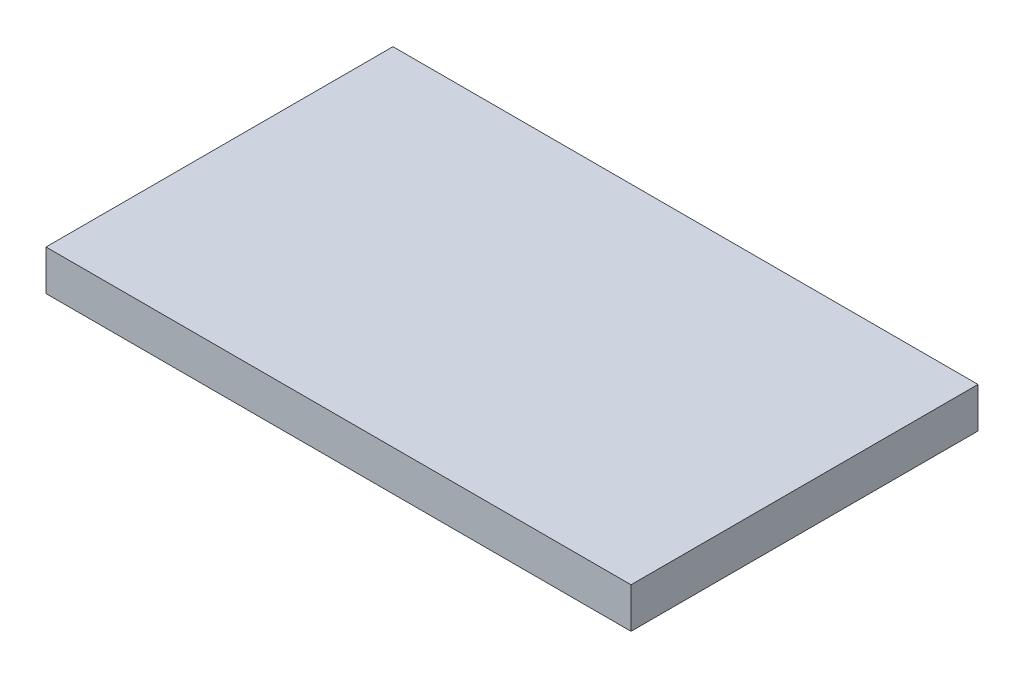
ISO-10303-21;
HEADER;
FILE_DESCRIPTION(('STEP AP214'),'2;1');
FILE_NAME('part.step','',(''),(''),'','','');
FILE_SCHEMA(('AUTOMOTIVE_DESIGN { 1 0 10303 214 1 1 1 1 }'));
ENDSEC;
DATA;
#1=APPLICATION_CONTEXT('core data for automotive mechanical design processes');
#2=APPLICATION_PROTOCOL_DEFINITION('international standard','automotive_design',2000,#1);
#3=PRODUCT_CONTEXT('',#1,'mechanical');
#4=PRODUCT('Part','Part','',(#3));
#5=PRODUCT_RELATED_PRODUCT_CATEGORY('part','',(#4));
#6=PRODUCT_DEFINITION_FORMATION('','',#4);
#7=PRODUCT_DEFINITION_CONTEXT('part definition',#1,'design');
#8=PRODUCT_DEFINITION('design','',#6,#7);
#9=PRODUCT_DEFINITION_SHAPE('','',#8);
#10=(LENGTH_UNIT() NAMED_UNIT(*) SI_UNIT(.MILLI.,.METRE.));
#11=(NAMED_UNIT(*) PLANE_ANGLE_UNIT() SI_UNIT($,.RADIAN.));
#12=(NAMED_UNIT(*) SI_UNIT($,.STERADIAN.) SOLID_ANGLE_UNIT());
#13=UNCERTAINTY_MEASURE_WITH_UNIT(LENGTH_MEASURE(1.E-05),#10,'distance_accuracy_value','');
#14=(GEOMETRIC_REPRESENTATION_CONTEXT(3) GLOBAL_UNCERTAINTY_ASSIGNED_CONTEXT((#13)) GLOBAL_UNIT_ASSIGNED_CONTEXT((#10,
#11,#12)) REPRESENTATION_CONTEXT('',''));
#15=CARTESIAN_POINT('',(0.,0.,0.));
#16=DIRECTION('',(0.,0.,1.));
#17=DIRECTION('',(1.,0.,0.));
#18=AXIS2_PLACEMENT_3D('',#15,#16,#17);
#19=CARTESIAN_POINT('',(0.,10.,0.));
#20=DIRECTION('',(1.,0.,0.));
#21=DIRECTION('',(0.,0.,-1.));
#22=AXIS2_PLACEMENT_3D('',#19,#20,#21);
#23=PLANE('',#22);
#24=DIRECTION('',(0.,0.,1.));
#25=VECTOR('',#24,1.);
#26=CARTESIAN_POINT('',(0.,0.,0.));
#27=LINE('',#26,#25);
#28=CARTESIAN_POINT('',(0.,0.,-86.));
#29=VERTEX_POINT('',#28);
#30=CARTESIAN_POINT('',(0.,0.,0.));
#31=VERTEX_POINT('',#30);
#32=EDGE_CURVE('E96',#29,#31,#27,.T.);
#33=ORIENTED_EDGE('',*,*,#32,.T.);
#34=DIRECTION('',(0.,-1.,0.));
#35=VECTOR('',#34,1.);
#36=CARTESIAN_POINT('',(0.,10.,0.));
#37=LINE('',#36,#35);
#38=CARTESIAN_POINT('',(0.,10.,0.));
#39=VERTEX_POINT('',#38);
#40=EDGE_CURVE('E11',#39,#31,#37,.T.);
#41=ORIENTED_EDGE('',*,*,#40,.F.);
#42=DIRECTION('',(0.,0.,1.));
#43=VECTOR('',#42,1.);
#44=CARTESIAN_POINT('',(0.,10.,0.));
#45=LINE('',#44,#43);
#46=CARTESIAN_POINT('',(0.,10.,-86.));
#47=VERTEX_POINT('',#46);
#48=EDGE_CURVE('E84',#47,#39,#45,.T.);
#49=ORIENTED_EDGE('',*,*,#48,.F.);
#50=DIRECTION('',(0.,-1.,0.));
#51=VECTOR('',#50,1.);
#52=CARTESIAN_POINT('',(0.,10.,-86.));
#53=LINE('',#52,#51);
#54=EDGE_CURVE('E92',#47,#29,#53,.T.);
#55=ORIENTED_EDGE('',*,*,#54,.T.);
#56=EDGE_LOOP('',(#33,#41,#49,#55));
#57=FACE_BOUND('',#56,.T.);
#58=ADVANCED_FACE('F33',(#57),#23,.F.);
#59=CARTESIAN_POINT('',(0.,10.,0.));
#60=DIRECTION('',(0.,0.,-1.));
#61=DIRECTION('',(-1.,0.,0.));
#62=AXIS2_PLACEMENT_3D('',#59,#60,#61);
#63=PLANE('',#62);
#64=DIRECTION('',(1.,0.,0.));
#65=VECTOR('',#64,1.);
#66=CARTESIAN_POINT('',(0.,0.,0.));
#67=LINE('',#66,#65);
#68=CARTESIAN_POINT('',(145.,0.,0.));
#69=VERTEX_POINT('',#68);
#70=EDGE_CURVE('E88',#31,#69,#67,.T.);
#71=ORIENTED_EDGE('',*,*,#70,.T.);
#72=DIRECTION('',(0.,-1.,0.));
#73=VECTOR('',#72,1.);
#74=CARTESIAN_POINT('',(145.,10.,0.));
#75=LINE('',#74,#73);
#76=CARTESIAN_POINT('',(145.,10.,0.));
#77=VERTEX_POINT('',#76);
#78=EDGE_CURVE('E41',#77,#69,#75,.T.);
#79=ORIENTED_EDGE('',*,*,#78,.F.);
#80=DIRECTION('',(1.,0.,0.));
#81=VECTOR('',#80,1.);
#82=CARTESIAN_POINT('',(0.,10.,0.));
#83=LINE('',#82,#81);
#84=EDGE_CURVE('E79',#39,#77,#83,.T.);
#85=ORIENTED_EDGE('',*,*,#84,.F.);
#86=ORIENTED_EDGE('',*,*,#40,.T.);
#87=EDGE_LOOP('',(#71,#79,#85,#86));
#88=FACE_BOUND('',#87,.T.);
#89=ADVANCED_FACE('F87',(#88),#63,.F.);
#90=CARTESIAN_POINT('',(145.,10.,0.));
#91=DIRECTION('',(-1.,0.,0.));
#92=DIRECTION('',(0.,0.,1.));
#93=AXIS2_PLACEMENT_3D('',#90,#91,#92);
#94=PLANE('',#93);
#95=DIRECTION('',(0.,0.,-1.));
#96=VECTOR('',#95,1.);
#97=CARTESIAN_POINT('',(145.,0.,0.));
#98=LINE('',#97,#96);
#99=CARTESIAN_POINT('',(145.,0.,-86.));
#100=VERTEX_POINT('',#99);
#101=EDGE_CURVE('E66',#69,#100,#98,.T.);
#102=ORIENTED_EDGE('',*,*,#101,.T.);
#103=DIRECTION('',(0.,-1.,0.));
#104=VECTOR('',#103,1.);
#105=CARTESIAN_POINT('',(145.,10.,-86.));
#106=LINE('',#105,#104);
#107=CARTESIAN_POINT('',(145.,10.,-86.));
#108=VERTEX_POINT('',#107);
#109=EDGE_CURVE('E89',#108,#100,#106,.T.);
#110=ORIENTED_EDGE('',*,*,#109,.F.);
#111=DIRECTION('',(0.,0.,-1.));
#112=VECTOR('',#111,1.);
#113=CARTESIAN_POINT('',(145.,10.,0.));
#114=LINE('',#113,#112);
#115=EDGE_CURVE('E82',#77,#108,#114,.T.);
#116=ORIENTED_EDGE('',*,*,#115,.F.);
#117=ORIENTED_EDGE('',*,*,#78,.T.);
#118=EDGE_LOOP('',(#102,#110,#116,#117));
#119=FACE_BOUND('',#118,.T.);
#120=ADVANCED_FACE('F90',(#119),#94,.F.);
#121=CARTESIAN_POINT('',(0.,10.,-86.));
#122=DIRECTION('',(0.,0.,1.));
#123=DIRECTION('',(1.,0.,0.));
#124=AXIS2_PLACEMENT_3D('',#121,#122,#123);
#125=PLANE('',#124);
#126=DIRECTION('',(-1.,0.,0.));
#127=VECTOR('',#126,1.);
#128=CARTESIAN_POINT('',(0.,0.,-86.));
#129=LINE('',#128,#127);
#130=EDGE_CURVE('E72',#100,#29,#129,.T.);
#131=ORIENTED_EDGE('',*,*,#130,.T.);
#132=ORIENTED_EDGE('',*,*,#54,.F.);
#133=DIRECTION('',(-1.,0.,0.));
#134=VECTOR('',#133,1.);
#135=CARTESIAN_POINT('',(0.,10.,-86.));
#136=LINE('',#135,#134);
#137=EDGE_CURVE('E49',#108,#47,#136,.T.);
#138=ORIENTED_EDGE('',*,*,#137,.F.);
#139=ORIENTED_EDGE('',*,*,#109,.T.);
#140=EDGE_LOOP('',(#131,#132,#138,#139));
#141=FACE_BOUND('',#140,.T.);
#142=ADVANCED_FACE('F103',(#141),#125,.F.);
#143=CARTESIAN_POINT('',(0.,10.,0.));
#144=DIRECTION('',(0.,-1.,0.));
#145=DIRECTION('',(0.,0.,-1.));
#146=AXIS2_PLACEMENT_3D('',#143,#144,#145);
#147=PLANE('',#146);
#148=ORIENTED_EDGE('',*,*,#48,.T.);
#149=ORIENTED_EDGE('',*,*,#84,.T.);
#150=ORIENTED_EDGE('',*,*,#115,.T.);
#151=ORIENTED_EDGE('',*,*,#137,.T.);
#152=EDGE_LOOP('',(#148,#149,#150,#151));
#153=FACE_BOUND('',#152,.T.);
#154=ADVANCED_FACE('F80',(#153),#147,.F.);
#155=CARTESIAN_POINT('',(0.,0.,0.));
#156=DIRECTION('',(0.,-1.,0.));
#157=DIRECTION('',(0.,0.,-1.));
#158=AXIS2_PLACEMENT_3D('',#155,#156,#157);
#159=PLANE('',#158);
#160=ORIENTED_EDGE('',*,*,#32,.F.);
#161=ORIENTED_EDGE('',*,*,#130,.F.);
#162=ORIENTED_EDGE('',*,*,#101,.F.);
#163=ORIENTED_EDGE('',*,*,#70,.F.);
#164=EDGE_LOOP('',(#160,#161,#162,#163));
#165=FACE_BOUND('',#164,.T.);
#166=ADVANCED_FACE('F106',(#165),#159,.T.);
#167=CLOSED_SHELL('',(#58,#89,#120,#142,#154,#166));
#168=MANIFOLD_SOLID_BREP('B2',#167);
#169=ADVANCED_BREP_SHAPE_REPRESENTATION('',(#18,#168),#14);
#170=SHAPE_DEFINITION_REPRESENTATION(#9,#169);
ENDSEC;
END-ISO-10303-21;
